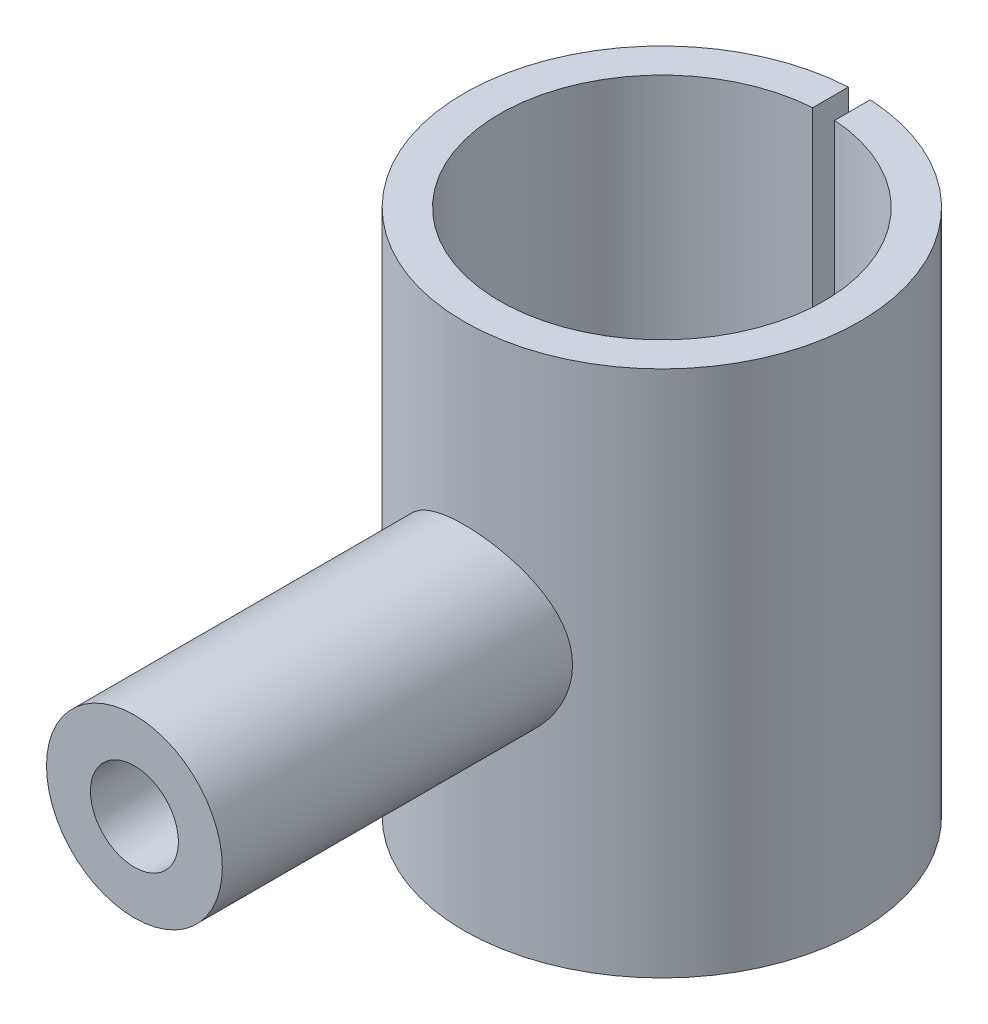
ISO-10303-21;
HEADER;
FILE_DESCRIPTION(('STEP AP214'),'2;1');
FILE_NAME('part.step','',(''),(''),'','','');
FILE_SCHEMA(('AUTOMOTIVE_DESIGN { 1 0 10303 214 1 1 1 1 }'));
ENDSEC;
DATA;
#1=APPLICATION_CONTEXT('core data for automotive mechanical design processes');
#2=APPLICATION_PROTOCOL_DEFINITION('international standard','automotive_design',2000,#1);
#3=PRODUCT_CONTEXT('',#1,'mechanical');
#4=PRODUCT('Part','Part','',(#3));
#5=PRODUCT_RELATED_PRODUCT_CATEGORY('part','',(#4));
#6=PRODUCT_DEFINITION_FORMATION('','',#4);
#7=PRODUCT_DEFINITION_CONTEXT('part definition',#1,'design');
#8=PRODUCT_DEFINITION('design','',#6,#7);
#9=PRODUCT_DEFINITION_SHAPE('','',#8);
#10=(LENGTH_UNIT() NAMED_UNIT(*) SI_UNIT(.MILLI.,.METRE.));
#11=(NAMED_UNIT(*) PLANE_ANGLE_UNIT() SI_UNIT($,.RADIAN.));
#12=(NAMED_UNIT(*) SI_UNIT($,.STERADIAN.) SOLID_ANGLE_UNIT());
#13=UNCERTAINTY_MEASURE_WITH_UNIT(LENGTH_MEASURE(1.E-05),#10,'distance_accuracy_value','');
#14=(GEOMETRIC_REPRESENTATION_CONTEXT(3) GLOBAL_UNCERTAINTY_ASSIGNED_CONTEXT((#13)) GLOBAL_UNIT_ASSIGNED_CONTEXT((#10,
#11,#12)) REPRESENTATION_CONTEXT('',''));
#15=CARTESIAN_POINT('',(0.,0.,0.));
#16=DIRECTION('',(0.,0.,1.));
#17=DIRECTION('',(1.,0.,0.));
#18=AXIS2_PLACEMENT_3D('',#15,#16,#17);
#19=CARTESIAN_POINT('',(0.,76.2,0.));
#20=DIRECTION('',(0.,-1.,0.));
#21=DIRECTION('',(0.,0.,-1.));
#22=AXIS2_PLACEMENT_3D('',#19,#20,#21);
#23=CYLINDRICAL_SURFACE('',#22,28.575);
#24=CARTESIAN_POINT('',(0.,0.,0.));
#25=DIRECTION('',(0.,1.,0.));
#26=DIRECTION('',(0.,0.,1.));
#27=AXIS2_PLACEMENT_3D('',#24,#25,#26);
#28=CIRCLE('',#27,28.575);
#29=CARTESIAN_POINT('',(-1.5875,0.,-28.5308686995331));
#30=VERTEX_POINT('',#29);
#31=CARTESIAN_POINT('',(1.5875,0.,-28.5308686995331));
#32=VERTEX_POINT('',#31);
#33=EDGE_CURVE('E95',#30,#32,#28,.T.);
#34=ORIENTED_EDGE('',*,*,#33,.T.);
#35=DIRECTION('',(0.,-1.,0.));
#36=VECTOR('',#35,1.);
#37=CARTESIAN_POINT('',(1.5875,76.2,-28.5308686995331));
#38=LINE('',#37,#36);
#39=CARTESIAN_POINT('',(1.5875,76.2,-28.5308686995331));
#40=VERTEX_POINT('',#39);
#41=EDGE_CURVE('E58',#32,#40,#38,.F.);
#42=ORIENTED_EDGE('',*,*,#41,.T.);
#43=CARTESIAN_POINT('',(0.,76.2,0.));
#44=DIRECTION('',(0.,1.,0.));
#45=DIRECTION('',(0.,0.,1.));
#46=AXIS2_PLACEMENT_3D('',#43,#44,#45);
#47=CIRCLE('',#46,28.575);
#48=CARTESIAN_POINT('',(-1.5875,76.2,-28.5308686995331));
#49=VERTEX_POINT('',#48);
#50=EDGE_CURVE('E88',#49,#40,#47,.T.);
#51=ORIENTED_EDGE('',*,*,#50,.F.);
#52=DIRECTION('',(0.,-1.,0.));
#53=VECTOR('',#52,1.);
#54=CARTESIAN_POINT('',(-1.5875,76.2,-28.5308686995331));
#55=LINE('',#54,#53);
#56=EDGE_CURVE('E73',#49,#30,#55,.T.);
#57=ORIENTED_EDGE('',*,*,#56,.T.);
#58=EDGE_LOOP('',(#34,#42,#51,#57));
#59=FACE_BOUND('',#58,.T.);
#60=CARTESIAN_POINT('',(-12.7,38.1,25.5976683508479));
#61=CARTESIAN_POINT('',(-12.699997327966,37.7635856181753,25.5976713492033));
#62=CARTESIAN_POINT('',(-12.6866138695812,37.4270792451345,25.6043232716176));
#63=CARTESIAN_POINT('',(-12.6332257255434,36.7565569537208,25.6307059846969));
#64=CARTESIAN_POINT('',(-12.5932051985643,36.4225426369993,25.6504445580944));
#65=CARTESIAN_POINT('',(-12.4868948825839,35.7589277271355,25.7023652959666));
#66=CARTESIAN_POINT('',(-12.4205461877994,35.4293387563965,25.7345753598009));
#67=CARTESIAN_POINT('',(-12.2623412625626,34.777743163896,25.8103328961993));
#68=CARTESIAN_POINT('',(-12.1704885091685,34.4557355150331,25.8538788232547));
#69=CARTESIAN_POINT('',(-11.9626749046417,33.8227478502697,25.9506858796822));
#70=CARTESIAN_POINT('',(-11.84682368077,33.5117249654507,26.0039027003545));
#71=CARTESIAN_POINT('',(-11.5917946291175,32.9009785884305,26.1185844978387));
#72=CARTESIAN_POINT('',(-11.4526160697599,32.6012554509659,26.18004973332));
#73=CARTESIAN_POINT('',(-11.1520734566521,32.0147896359408,26.3094779024876));
#74=CARTESIAN_POINT('',(-10.9907186050112,31.7280416395752,26.3774381375125));
#75=CARTESIAN_POINT('',(-10.6467991676387,31.1686570911979,26.5181224005997));
#76=CARTESIAN_POINT('',(-10.464226836769,30.8960257450956,26.5908481639983));
#77=CARTESIAN_POINT('',(-10.0665807393352,30.3491628706289,26.7440242451697));
#78=CARTESIAN_POINT('',(-9.85017179839616,30.07595629345,26.8246705361347));
#79=CARTESIAN_POINT('',(-9.3958428470508,29.5484314925745,26.9871629233237));
#80=CARTESIAN_POINT('',(-9.15792191540722,29.2941140786444,27.0690090708049));
#81=CARTESIAN_POINT('',(-8.66170288787359,28.8055828326485,27.2318516211706));
#82=CARTESIAN_POINT('',(-8.40339308927126,28.5713807096748,27.3128475053621));
#83=CARTESIAN_POINT('',(-7.86794486895564,28.1246822246367,27.4718772001852));
#84=CARTESIAN_POINT('',(-7.59081292571202,27.9121784565425,27.5499120157287));
#85=CARTESIAN_POINT('',(-7.00451741730128,27.4999249079523,27.7049434774682));
#86=CARTESIAN_POINT('',(-6.69444155981389,27.3013737754519,27.7816853913379));
#87=CARTESIAN_POINT('',(-6.05684925830992,26.9312735740506,27.9276233682466));
#88=CARTESIAN_POINT('',(-5.72933205912699,26.7597256755963,27.9968191041591));
#89=CARTESIAN_POINT('',(-5.05914532722503,26.4453019228626,28.12564748294));
#90=CARTESIAN_POINT('',(-4.71648175427137,26.3024149115784,28.1852838452232));
#91=CARTESIAN_POINT('',(-4.01837666169148,26.0467518019702,28.2932496738143));
#92=CARTESIAN_POINT('',(-3.66293617948707,25.9339732652249,28.3415800557302));
#93=CARTESIAN_POINT('',(-2.96309811169387,25.7455018467772,28.4230093794415));
#94=CARTESIAN_POINT('',(-2.61926287039832,25.6680317363786,28.4568314258619));
#95=CARTESIAN_POINT('',(-1.92537523516523,25.5418449247719,28.5121844028472));
#96=CARTESIAN_POINT('',(-1.57532306280401,25.4931272009163,28.5337157705585));
#97=CARTESIAN_POINT('',(-0.871960299437756,25.4250452510414,28.5638612726751));
#98=CARTESIAN_POINT('',(-0.518651049612987,25.4056694422375,28.5724805041597));
#99=CARTESIAN_POINT('',(0.188420819197821,25.39647734147,28.5765654021095));
#100=CARTESIAN_POINT('',(0.542183416903979,25.4066597094506,28.5720316648806));
#101=CARTESIAN_POINT('',(1.22280552255548,25.454725336652,28.5507125131411));
#102=CARTESIAN_POINT('',(1.54983333075861,25.4906437903109,28.5347962465009));
#103=CARTESIAN_POINT('',(2.19940649961973,25.5875887421072,28.4920895241202));
#104=CARTESIAN_POINT('',(2.521952107113,25.6486138519083,28.4652996696636));
#105=CARTESIAN_POINT('',(3.16039839408475,25.7951567746454,28.4015042920626));
#106=CARTESIAN_POINT('',(3.4762988501764,25.8806754095603,28.3644984260803));
#107=CARTESIAN_POINT('',(4.09944740630779,26.0753960998264,28.2811595598454));
#108=CARTESIAN_POINT('',(4.40669522981575,26.1845989111382,28.2348262618796));
#109=CARTESIAN_POINT('',(5.01531168397176,26.4275692633062,28.1331460943635));
#110=CARTESIAN_POINT('',(5.31652020881048,26.5616846164538,28.0776730455757));
#111=CARTESIAN_POINT('',(5.90647133117426,26.8522569070675,27.9595196115664));
#112=CARTESIAN_POINT('',(6.19521390938464,27.0087138791479,27.8968392151784));
#113=CARTESIAN_POINT('',(6.75879209700934,27.342859898506,27.7656816441141));
#114=CARTESIAN_POINT('',(7.03362615047019,27.52055131385,27.6972038231575));
#115=CARTESIAN_POINT('',(7.56814453162147,27.8960829103156,27.5559480595288));
#116=CARTESIAN_POINT('',(7.82782292055996,28.093930907525,27.4831684533878));
#117=CARTESIAN_POINT('',(8.35048211654676,28.524876610282,27.3291054298983));
#118=CARTESIAN_POINT('',(8.61212372248667,28.7595220316533,27.2476028121537));
#119=CARTESIAN_POINT('',(9.11491897145408,29.2494923620573,27.083552682026));
#120=CARTESIAN_POINT('',(9.35607182136133,29.5048180708778,27.0010051293355));
#121=CARTESIAN_POINT('',(9.81667208238307,30.034873071904,26.836977663645));
#122=CARTESIAN_POINT('',(10.0361104688375,30.3096103510447,26.7554982066549));
#123=CARTESIAN_POINT('',(10.4518969012457,30.8770104821246,26.5958284311184));
#124=CARTESIAN_POINT('',(10.6482413084791,31.1696761478675,26.5176386321386));
#125=CARTESIAN_POINT('',(11.0242188015048,31.7840152850362,26.3636155489879));
#126=CARTESIAN_POINT('',(11.2028046658546,32.1063906877961,26.2880188949901));
#127=CARTESIAN_POINT('',(11.5318423387299,32.7668345896961,26.145351448534));
#128=CARTESIAN_POINT('',(11.6823067445077,33.1048959770366,26.0782768428824));
#129=CARTESIAN_POINT('',(11.9536430334145,33.7944654355975,25.9550238219666));
#130=CARTESIAN_POINT('',(12.0745277409602,34.1459676028028,25.8988406868572));
#131=CARTESIAN_POINT('',(12.2853722493674,34.8599186595767,25.7994936429252));
#132=CARTESIAN_POINT('',(12.3753352718411,35.2223664044843,25.7563283778779));
#133=CARTESIAN_POINT('',(12.5179302765336,35.9292648861481,25.6873093729952));
#134=CARTESIAN_POINT('',(12.5727519738217,36.2731761986204,25.6604474285804));
#135=CARTESIAN_POINT('',(12.6539876138767,36.965133443365,25.6204857706812));
#136=CARTESIAN_POINT('',(12.6804029247936,37.3131791756927,25.6073853943927));
#137=CARTESIAN_POINT('',(12.7044714341516,38.0103769909922,25.5954529427569));
#138=CARTESIAN_POINT('',(12.7021353924347,38.359528611196,25.5966155296695));
#139=CARTESIAN_POINT('',(12.6687579125852,39.0561082203677,25.6131518291473));
#140=CARTESIAN_POINT('',(12.6377176058756,39.4035362767299,25.628524981581));
#141=CARTESIAN_POINT('',(12.5508568015748,40.0670053714474,25.671165474155));
#142=CARTESIAN_POINT('',(12.4971446142819,40.3833910930548,25.697417999628));
#143=CARTESIAN_POINT('',(12.3661999747721,41.0102681040814,25.7606872499087));
#144=CARTESIAN_POINT('',(12.2889595120747,41.3207573476681,25.7977076405697));
#145=CARTESIAN_POINT('',(12.1117322796483,41.933761777312,25.8813861991208));
#146=CARTESIAN_POINT('',(12.0117497559969,42.236278440147,25.9280425677671));
#147=CARTESIAN_POINT('',(11.7898584136153,42.8318357090821,26.0296897590299));
#148=CARTESIAN_POINT('',(11.667940982563,43.1248725395974,26.0846838539561));
#149=CARTESIAN_POINT('',(11.3972665311839,43.7126271248248,26.2041174577956));
#150=CARTESIAN_POINT('',(11.2475597078809,44.0068441552566,26.268867493406));
#151=CARTESIAN_POINT('',(10.9262942858888,44.5818684127944,26.4041113388366));
#152=CARTESIAN_POINT('',(10.754726146677,44.8626697111173,26.4746076515277));
#153=CARTESIAN_POINT('',(10.3908314957672,45.4094798046311,26.6195341345342));
#154=CARTESIAN_POINT('',(10.198501263154,45.6754859352935,26.693965008765));
#155=CARTESIAN_POINT('',(9.794165044481,46.1914631586694,26.8449534890409));
#156=CARTESIAN_POINT('',(9.582158026193,46.4414334089892,26.9215112065105));
#157=CARTESIAN_POINT('',(9.11841522453159,46.9472120308447,27.0822993509983));
#158=CARTESIAN_POINT('',(8.86481875707591,47.2013064978325,27.1665656789871));
#159=CARTESIAN_POINT('',(8.33679131828898,47.6873159989074,27.333224328211));
#160=CARTESIAN_POINT('',(8.06236716583363,47.919238236356,27.4156172514062));
#161=CARTESIAN_POINT('',(7.49393702462966,48.3596412136342,27.5764176263404));
#162=CARTESIAN_POINT('',(7.19991993658644,48.5681084834763,27.6548227739154));
#163=CARTESIAN_POINT('',(6.59422885541936,48.9598417024785,27.805468959327));
#164=CARTESIAN_POINT('',(6.28256259061225,49.1431185634906,27.8777126609678));
#165=CARTESIAN_POINT('',(5.64048865350532,49.4845620807821,28.0147139907725));
#166=CARTESIAN_POINT('',(5.30993939273918,49.6424918621749,28.0793996177268));
#167=CARTESIAN_POINT('',(4.63485179525903,49.9297379892273,28.1986922851326));
#168=CARTESIAN_POINT('',(4.2903132165467,50.0590538396506,28.2532991511432));
#169=CARTESIAN_POINT('',(3.58998690534544,50.2875995524898,28.3507940758034));
#170=CARTESIAN_POINT('',(3.23420562237571,50.3868463304339,28.3936887218827));
#171=CARTESIAN_POINT('',(2.51408770740302,50.5541545345403,28.4664873577243));
#172=CARTESIAN_POINT('',(2.14975183347764,50.6222187131116,28.4963924940258));
#173=CARTESIAN_POINT('',(1.44417478475763,50.7222541439613,28.5404990677894));
#174=CARTESIAN_POINT('',(1.10333563954635,50.7566165205415,28.5557391084525));
#175=CARTESIAN_POINT('',(0.419675127870113,50.7976816989786,28.5739636581927));
#176=CARTESIAN_POINT('',(0.0768538703630382,50.8043860070088,28.576948834632));
#177=CARTESIAN_POINT('',(-0.608022086576996,50.7900594550959,28.5705826984788));
#178=CARTESIAN_POINT('',(-0.950076922545896,50.7690340073268,28.5612337931988));
#179=CARTESIAN_POINT('',(-1.63082745070393,50.699502408862,28.53045940832));
#180=CARTESIAN_POINT('',(-1.96952318182976,50.6509965770818,28.5090340688706));
#181=CARTESIAN_POINT('',(-2.6260553289559,50.5298137974659,28.4558970688691));
#182=CARTESIAN_POINT('',(-2.944149555996,50.4583076771885,28.4246852172738));
#183=CARTESIAN_POINT('',(-3.57285681597859,50.2914097946638,28.3525208424444));
#184=CARTESIAN_POINT('',(-3.88347014168942,50.1960189688255,28.3115687010851));
#185=CARTESIAN_POINT('',(-4.49536857902066,49.9822016011967,28.2208782804644));
#186=CARTESIAN_POINT('',(-4.7966526542388,49.863772510613,28.1711390291145));
#187=CARTESIAN_POINT('',(-5.38817778085994,49.6048593574052,28.0640077121352));
#188=CARTESIAN_POINT('',(-5.67841835250714,49.4643743379755,28.0066153145219));
#189=CARTESIAN_POINT('',(-6.25931680657394,49.1554984215123,27.8826784247913));
#190=CARTESIAN_POINT('',(-6.54938952698414,48.9861267435244,27.8158358349167));
#191=CARTESIAN_POINT('',(-7.1144058021182,48.6255685940265,27.6767149915685));
#192=CARTESIAN_POINT('',(-7.38934378747819,48.4343741705592,27.6044347599724));
#193=CARTESIAN_POINT('',(-7.92270090102938,48.0313922216593,27.4561118002852));
#194=CARTESIAN_POINT('',(-8.18111640624793,47.8196002051748,27.3800682534326));
#195=CARTESIAN_POINT('',(-8.68012801102483,47.3766740795481,27.2259839450273));
#196=CARTESIAN_POINT('',(-8.92072479608372,47.1455407152124,27.1479432604617));
#197=CARTESIAN_POINT('',(-9.40121966468652,46.6461346360497,26.9854957710077));
#198=CARTESIAN_POINT('',(-9.63956478474693,46.3763704789869,26.9010725097106));
#199=CARTESIAN_POINT('',(-10.0928014037676,45.8171821158293,26.7343283427612));
#200=CARTESIAN_POINT('',(-10.3076917648518,45.5277569570115,26.6520075392551));
#201=CARTESIAN_POINT('',(-10.7127325018487,44.9306357884878,26.4917998486235));
#202=CARTESIAN_POINT('',(-10.9028677345931,44.6229287614562,26.4139156917074));
#203=CARTESIAN_POINT('',(-11.2568295732094,43.9910881237402,26.2650204709844));
#204=CARTESIAN_POINT('',(-11.420653528755,43.6669528625662,26.1940100998574));
#205=CARTESIAN_POINT('',(-11.72114996659,43.0028576979387,26.0609363802201));
#206=CARTESIAN_POINT('',(-11.8577067745111,42.6628376243609,25.9989114431288));
#207=CARTESIAN_POINT('',(-12.1013296664917,41.9707009497814,25.8864147372333));
#208=CARTESIAN_POINT('',(-12.2084104907662,41.618590494332,25.8359371960017));
#209=CARTESIAN_POINT('',(-12.3916402468332,40.9057675422631,25.7485566339286));
#210=CARTESIAN_POINT('',(-12.4678703874031,40.5450803107273,25.7116179989269));
#211=CARTESIAN_POINT('',(-12.5887346412339,39.8174363138739,25.652659903681));
#212=CARTESIAN_POINT('',(-12.6333924953597,39.4504844723574,25.630629233888));
#213=CARTESIAN_POINT('',(-12.6746362905175,38.9188190131297,25.6102394860751));
#214=CARTESIAN_POINT('',(-12.6841437031075,38.7552467793249,25.6055300803344));
#215=CARTESIAN_POINT('',(-12.6968262955209,38.4277903148691,25.5992437393876));
#216=CARTESIAN_POINT('',(-12.7000013018546,38.2639060757934,25.5976668900047));
#217=CARTESIAN_POINT('',(-12.7,38.1,25.5976683508479));
#218=B_SPLINE_CURVE_WITH_KNOTS('',3,(#60,#61,#62,#63,#64,#65,#66,#67,#68,#69,#70,#71,#72,#73,
#74,#75,#76,#77,#78,#79,#80,#81,#82,#83,#84,#85,#86,#87,#88,#89,#90,#91,#92,#93,#94,#95,#96,#97,
#98,#99,#100,#101,#102,#103,#104,#105,#106,#107,#108,#109,#110,#111,#112,#113,#114,#115,#116,
#117,#118,#119,#120,#121,#122,#123,#124,#125,#126,#127,#128,#129,#130,#131,#132,#133,#134,#135,
#136,#137,#138,#139,#140,#141,#142,#143,#144,#145,#146,#147,#148,#149,#150,#151,#152,#153,#154,
#155,#156,#157,#158,#159,#160,#161,#162,#163,#164,#165,#166,#167,#168,#169,#170,#171,#172,#173,
#174,#175,#176,#177,#178,#179,#180,#181,#182,#183,#184,#185,#186,#187,#188,#189,#190,#191,#192,
#193,#194,#195,#196,#197,#198,#199,#200,#201,#202,#203,#204,#205,#206,#207,#208,#209,#210,#211,
#212,#213,#214,#215,#216,#217),.UNSPECIFIED.,.T.,.F.,(4,2,2,2,2,2,2,2,2,2,2,2,2,2,2,2,2,2,2,2,2,
2,2,2,2,2,2,2,2,2,2,2,2,2,2,2,2,2,2,2,2,2,2,2,2,2,2,2,2,2,2,2,2,2,2,2,2,2,2,2,2,2,2,2,2,2,2,2,2,
2,2,2,2,2,2,2,2,2,4),(0.,1.00907339930406,2.01874744130542,3.03069334849076,4.04250136120085,
5.0497854246708,6.05710108384787,7.06400000975967,8.07126765115636,9.14332220608516,
10.2154226928282,11.2881430774853,12.360496091256,13.4873979731032,14.6143486867098,
15.7408598500467,16.8672797519407,17.92810197268,18.9888864604556,20.0492520920006,
21.109569651335,22.096544408081,23.0834645948865,24.0704179056604,25.0574027230216,
26.0593738513021,27.0613465319762,28.0634310571561,29.0659056489267,30.1470273305109,
31.2281908432919,32.3098018233054,33.3915829958396,34.518766209956,35.6454432759277,
36.7716309968299,37.8977013489452,38.9441544186024,39.9905570851945,41.0365681602971,
42.0825380070101,43.0473953656793,44.0125815893388,44.9775877547132,45.9429736414696,
46.9511303916022,47.9597286292346,48.9685079256071,49.9773401716651,51.0823147386169,
52.1869290903632,53.2921746091358,54.39693984419,55.5114937399331,56.6260669243351,
57.7400119300051,58.8538585916169,59.8812629262531,60.9086113108765,61.9357592117538,
62.9628951926109,63.9443539380381,64.9257742110283,65.9073031233318,66.8888746269937,
67.915231281243,68.9419631292576,69.9689193475658,70.995836037496,72.1037783245988,
73.2117743381679,74.3204449803203,75.4292272285503,76.542617701136,77.65545037882,
78.7653343710533,79.8743828928315,80.3660049485093,80.8576404730379),.UNSPECIFIED.);
#219=CARTESIAN_POINT('',(-12.7,38.1,25.5976683508479));
#220=VERTEX_POINT('',#219);
#221=EDGE_CURVE('E94',#220,#220,#218,.T.);
#222=ORIENTED_EDGE('',*,*,#221,.F.);
#223=EDGE_LOOP('',(#222));
#224=FACE_BOUND('',#223,.T.);
#225=ADVANCED_FACE('F35',(#59,#224),#23,.T.);
#226=CARTESIAN_POINT('',(0.,76.2,0.));
#227=DIRECTION('',(0.,-1.,0.));
#228=DIRECTION('',(0.,0.,-1.));
#229=AXIS2_PLACEMENT_3D('',#226,#227,#228);
#230=CYLINDRICAL_SURFACE('',#229,23.4315);
#231=DIRECTION('',(0.,-1.,0.));
#232=VECTOR('',#231,1.);
#233=CARTESIAN_POINT('',(1.5875,76.2,-23.3776610463921));
#234=LINE('',#233,#232);
#235=CARTESIAN_POINT('',(1.5875,0.,-23.3776610463921));
#236=VERTEX_POINT('',#235);
#237=CARTESIAN_POINT('',(1.5875,76.2,-23.3776610463921));
#238=VERTEX_POINT('',#237);
#239=EDGE_CURVE('E81',#236,#238,#234,.F.);
#240=ORIENTED_EDGE('',*,*,#239,.F.);
#241=CARTESIAN_POINT('',(0.,0.,0.));
#242=DIRECTION('',(0.,1.,0.));
#243=DIRECTION('',(0.,0.,1.));
#244=AXIS2_PLACEMENT_3D('',#241,#242,#243);
#245=CIRCLE('',#244,23.4315);
#246=CARTESIAN_POINT('',(-1.5875,0.,-23.3776610463921));
#247=VERTEX_POINT('',#246);
#248=EDGE_CURVE('E102',#247,#236,#245,.T.);
#249=ORIENTED_EDGE('',*,*,#248,.F.);
#250=DIRECTION('',(0.,-1.,0.));
#251=VECTOR('',#250,1.);
#252=CARTESIAN_POINT('',(-1.5875,76.2,-23.3776610463921));
#253=LINE('',#252,#251);
#254=CARTESIAN_POINT('',(-1.5875,76.2,-23.3776610463921));
#255=VERTEX_POINT('',#254);
#256=EDGE_CURVE('E50',#255,#247,#253,.T.);
#257=ORIENTED_EDGE('',*,*,#256,.F.);
#258=CARTESIAN_POINT('',(0.,76.2,0.));
#259=DIRECTION('',(0.,1.,0.));
#260=DIRECTION('',(0.,0.,1.));
#261=AXIS2_PLACEMENT_3D('',#258,#259,#260);
#262=CIRCLE('',#261,23.4315);
#263=EDGE_CURVE('E90',#255,#238,#262,.T.);
#264=ORIENTED_EDGE('',*,*,#263,.T.);
#265=EDGE_LOOP('',(#240,#249,#257,#264));
#266=FACE_BOUND('',#265,.T.);
#267=ADVANCED_FACE('F112',(#266),#230,.F.);
#268=CARTESIAN_POINT('',(0.,76.2,0.));
#269=DIRECTION('',(0.,1.,0.));
#270=DIRECTION('',(0.,0.,1.));
#271=AXIS2_PLACEMENT_3D('',#268,#269,#270);
#272=PLANE('',#271);
#273=DIRECTION('',(0.,0.,-1.));
#274=VECTOR('',#273,1.);
#275=CARTESIAN_POINT('',(1.5875,76.2,-6.15332996642651));
#276=LINE('',#275,#274);
#277=EDGE_CURVE('E91',#238,#40,#276,.T.);
#278=ORIENTED_EDGE('',*,*,#277,.F.);
#279=ORIENTED_EDGE('',*,*,#263,.F.);
#280=DIRECTION('',(0.,0.,1.));
#281=VECTOR('',#280,1.);
#282=CARTESIAN_POINT('',(-1.5875,76.2,-6.15332996642651));
#283=LINE('',#282,#281);
#284=EDGE_CURVE('E76',#49,#255,#283,.T.);
#285=ORIENTED_EDGE('',*,*,#284,.F.);
#286=ORIENTED_EDGE('',*,*,#50,.T.);
#287=EDGE_LOOP('',(#278,#279,#285,#286));
#288=FACE_BOUND('',#287,.T.);
#289=ADVANCED_FACE('F87',(#288),#272,.T.);
#290=CARTESIAN_POINT('',(0.,0.,0.));
#291=DIRECTION('',(0.,1.,0.));
#292=DIRECTION('',(0.,0.,1.));
#293=AXIS2_PLACEMENT_3D('',#290,#291,#292);
#294=PLANE('',#293);
#295=ORIENTED_EDGE('',*,*,#248,.T.);
#296=DIRECTION('',(0.,0.,-1.));
#297=VECTOR('',#296,1.);
#298=CARTESIAN_POINT('',(1.5875,0.,0.));
#299=LINE('',#298,#297);
#300=EDGE_CURVE('E11',#236,#32,#299,.T.);
#301=ORIENTED_EDGE('',*,*,#300,.T.);
#302=ORIENTED_EDGE('',*,*,#33,.F.);
#303=DIRECTION('',(0.,0.,1.));
#304=VECTOR('',#303,1.);
#305=CARTESIAN_POINT('',(-1.5875,0.,0.));
#306=LINE('',#305,#304);
#307=EDGE_CURVE('E43',#30,#247,#306,.T.);
#308=ORIENTED_EDGE('',*,*,#307,.T.);
#309=EDGE_LOOP('',(#295,#301,#302,#308));
#310=FACE_BOUND('',#309,.T.);
#311=ADVANCED_FACE('F109',(#310),#294,.F.);
#312=CARTESIAN_POINT('',(0.,38.1,76.2));
#313=DIRECTION('',(0.,0.,-1.));
#314=DIRECTION('',(-1.,0.,0.));
#315=AXIS2_PLACEMENT_3D('',#312,#313,#314);
#316=CYLINDRICAL_SURFACE('',#315,12.7);
#317=CARTESIAN_POINT('',(0.,38.1,76.2));
#318=DIRECTION('',(0.,0.,1.));
#319=DIRECTION('',(1.,0.,0.));
#320=AXIS2_PLACEMENT_3D('',#317,#318,#319);
#321=CIRCLE('',#320,12.7);
#322=CARTESIAN_POINT('',(12.7,38.1,76.2));
#323=VERTEX_POINT('',#322);
#324=EDGE_CURVE('E115',#323,#323,#321,.T.);
#325=ORIENTED_EDGE('',*,*,#324,.F.);
#326=EDGE_LOOP('',(#325));
#327=FACE_BOUND('',#326,.T.);
#328=ORIENTED_EDGE('',*,*,#221,.T.);
#329=EDGE_LOOP('',(#328));
#330=FACE_BOUND('',#329,.T.);
#331=ADVANCED_FACE('F125',(#327,#330),#316,.T.);
#332=CARTESIAN_POINT('',(0.,38.1,76.2));
#333=DIRECTION('',(0.,0.,-1.));
#334=DIRECTION('',(-1.,0.,0.));
#335=AXIS2_PLACEMENT_3D('',#332,#333,#334);
#336=CYLINDRICAL_SURFACE('',#335,6.35);
#337=CARTESIAN_POINT('',(0.,38.1,31.75));
#338=DIRECTION('',(0.,0.,1.));
#339=DIRECTION('',(1.,0.,0.));
#340=AXIS2_PLACEMENT_3D('',#337,#338,#339);
#341=CIRCLE('',#340,6.35);
#342=CARTESIAN_POINT('',(-6.35,38.1,31.75));
#343=VERTEX_POINT('',#342);
#344=EDGE_CURVE('E98',#343,#343,#341,.T.);
#345=CARTESIAN_POINT('',(0.,38.1,76.2));
#346=DIRECTION('',(0.,0.,1.));
#347=DIRECTION('',(1.,0.,0.));
#348=AXIS2_PLACEMENT_3D('',#345,#346,#347);
#349=CIRCLE('',#348,6.35);
#350=CARTESIAN_POINT('',(-6.35,38.1,76.2));
#351=VERTEX_POINT('',#350);
#352=EDGE_CURVE('E113',#351,#351,#349,.T.);
#353=CARTESIAN_POINT('',(-6.35,38.1,31.75));
#354=CARTESIAN_POINT('',(-6.35,38.1,32.2130208333333));
#355=CARTESIAN_POINT('',(-6.35,38.1,32.6760416666667));
#356=CARTESIAN_POINT('',(-6.35,38.1,33.6020833333333));
#357=CARTESIAN_POINT('',(-6.35,38.1,34.0651041666667));
#358=CARTESIAN_POINT('',(-6.35,38.1,34.9911458333333));
#359=CARTESIAN_POINT('',(-6.35,38.1,35.4541666666667));
#360=CARTESIAN_POINT('',(-6.35,38.1,36.3802083333333));
#361=CARTESIAN_POINT('',(-6.35,38.1,36.8432291666667));
#362=CARTESIAN_POINT('',(-6.35,38.1,37.7692708333333));
#363=CARTESIAN_POINT('',(-6.35,38.1,38.2322916666667));
#364=CARTESIAN_POINT('',(-6.35,38.1,39.1583333333333));
#365=CARTESIAN_POINT('',(-6.35,38.1,39.6213541666667));
#366=CARTESIAN_POINT('',(-6.35,38.1,40.5473958333333));
#367=CARTESIAN_POINT('',(-6.35,38.1,41.0104166666667));
#368=CARTESIAN_POINT('',(-6.35,38.1,41.9364583333333));
#369=CARTESIAN_POINT('',(-6.35,38.1,42.3994791666667));
#370=CARTESIAN_POINT('',(-6.35,38.1,43.3255208333333));
#371=CARTESIAN_POINT('',(-6.35,38.1,43.7885416666667));
#372=CARTESIAN_POINT('',(-6.35,38.1,44.7145833333333));
#373=CARTESIAN_POINT('',(-6.35,38.1,45.1776041666667));
#374=CARTESIAN_POINT('',(-6.35,38.1,46.1036458333333));
#375=CARTESIAN_POINT('',(-6.35,38.1,46.5666666666667));
#376=CARTESIAN_POINT('',(-6.35,38.1,47.4927083333333));
#377=CARTESIAN_POINT('',(-6.35,38.1,47.9557291666667));
#378=CARTESIAN_POINT('',(-6.35,38.1,48.8817708333333));
#379=CARTESIAN_POINT('',(-6.35,38.1,49.3447916666667));
#380=CARTESIAN_POINT('',(-6.35,38.1,50.2708333333333));
#381=CARTESIAN_POINT('',(-6.35,38.1,50.7338541666667));
#382=CARTESIAN_POINT('',(-6.35,38.1,51.6598958333333));
#383=CARTESIAN_POINT('',(-6.35,38.1,52.1229166666667));
#384=CARTESIAN_POINT('',(-6.35,38.1,53.0489583333333));
#385=CARTESIAN_POINT('',(-6.35,38.1,53.5119791666667));
#386=CARTESIAN_POINT('',(-6.35,38.1,54.4380208333333));
#387=CARTESIAN_POINT('',(-6.35,38.1,54.9010416666667));
#388=CARTESIAN_POINT('',(-6.35,38.1,55.8270833333333));
#389=CARTESIAN_POINT('',(-6.35,38.1,56.2901041666667));
#390=CARTESIAN_POINT('',(-6.35,38.1,57.2161458333333));
#391=CARTESIAN_POINT('',(-6.35,38.1,57.6791666666667));
#392=CARTESIAN_POINT('',(-6.35,38.1,58.6052083333333));
#393=CARTESIAN_POINT('',(-6.35,38.1,59.0682291666667));
#394=CARTESIAN_POINT('',(-6.35,38.1,59.9942708333333));
#395=CARTESIAN_POINT('',(-6.35,38.1,60.4572916666667));
#396=CARTESIAN_POINT('',(-6.35,38.1,61.3833333333333));
#397=CARTESIAN_POINT('',(-6.35,38.1,61.8463541666667));
#398=CARTESIAN_POINT('',(-6.35,38.1,62.7723958333333));
#399=CARTESIAN_POINT('',(-6.35,38.1,63.2354166666667));
#400=CARTESIAN_POINT('',(-6.35,38.1,64.1614583333333));
#401=CARTESIAN_POINT('',(-6.35,38.1,64.6244791666667));
#402=CARTESIAN_POINT('',(-6.35,38.1,65.5505208333333));
#403=CARTESIAN_POINT('',(-6.35,38.1,66.0135416666667));
#404=CARTESIAN_POINT('',(-6.35,38.1,66.9395833333333));
#405=CARTESIAN_POINT('',(-6.35,38.1,67.4026041666667));
#406=CARTESIAN_POINT('',(-6.35,38.1,68.3286458333333));
#407=CARTESIAN_POINT('',(-6.35,38.1,68.7916666666667));
#408=CARTESIAN_POINT('',(-6.35,38.1,69.7177083333333));
#409=CARTESIAN_POINT('',(-6.35,38.1,70.1807291666667));
#410=CARTESIAN_POINT('',(-6.35,38.1,71.1067708333333));
#411=CARTESIAN_POINT('',(-6.35,38.1,71.5697916666667));
#412=CARTESIAN_POINT('',(-6.35,38.1,72.4958333333333));
#413=CARTESIAN_POINT('',(-6.35,38.1,72.9588541666667));
#414=CARTESIAN_POINT('',(-6.35,38.1,73.8848958333333));
#415=CARTESIAN_POINT('',(-6.35,38.1,74.3479166666667));
#416=CARTESIAN_POINT('',(-6.35,38.1,75.2739583333333));
#417=CARTESIAN_POINT('',(-6.35,38.1,75.7369791666667));
#418=CARTESIAN_POINT('',(-6.35,38.1,76.2));
#419=B_SPLINE_CURVE_WITH_KNOTS('',3,(#353,#354,#355,#356,#357,#358,#359,#360,#361,#362,#363,
#364,#365,#366,#367,#368,#369,#370,#371,#372,#373,#374,#375,#376,#377,#378,#379,#380,#381,#382,
#383,#384,#385,#386,#387,#388,#389,#390,#391,#392,#393,#394,#395,#396,#397,#398,#399,#400,#401,
#402,#403,#404,#405,#406,#407,#408,#409,#410,#411,#412,#413,#414,#415,#416,#417,#418),
.UNSPECIFIED.,.F.,.F.,(4,2,2,2,2,2,2,2,2,2,2,2,2,2,2,2,2,2,2,2,2,2,2,2,2,2,2,2,2,2,2,2,4),(0.,
1.3890625,2.778125,4.1671875,5.55625,6.9453125,8.334375,9.7234375,11.1125,12.5015625,13.890625,
15.2796875,16.66875,18.0578125,19.446875,20.8359375,22.225,23.6140625,25.003125,26.3921875,
27.78125,29.1703125,30.559375,31.9484375,33.3375,34.7265625,36.115625,37.5046875,38.89375,
40.2828125,41.671875,43.0609375,44.45),.UNSPECIFIED.);
#420=EDGE_CURVE('BSEAM130',#343,#351,#419,.T.);
#421=ORIENTED_EDGE('',*,*,#344,.F.);
#422=ORIENTED_EDGE('',*,*,#352,.T.);
#423=ORIENTED_EDGE('',*,*,#420,.T.);
#424=ORIENTED_EDGE('',*,*,#420,.F.);
#425=EDGE_LOOP('',(#421,#423,#422,#424));
#426=FACE_BOUND('',#425,.T.);
#427=ADVANCED_FACE('F130',(#426),#336,.F.);
#428=CARTESIAN_POINT('',(0.,0.,76.2));
#429=DIRECTION('',(0.,0.,1.));
#430=DIRECTION('',(1.,0.,0.));
#431=AXIS2_PLACEMENT_3D('',#428,#429,#430);
#432=PLANE('',#431);
#433=ORIENTED_EDGE('',*,*,#324,.T.);
#434=EDGE_LOOP('',(#433));
#435=FACE_BOUND('',#434,.T.);
#436=ORIENTED_EDGE('',*,*,#352,.F.);
#437=EDGE_LOOP('',(#436));
#438=FACE_BOUND('',#437,.T.);
#439=ADVANCED_FACE('F180',(#435,#438),#432,.T.);
#440=CARTESIAN_POINT('',(0.,38.1,31.75));
#441=DIRECTION('',(0.,0.,1.));
#442=DIRECTION('',(1.,0.,0.));
#443=AXIS2_PLACEMENT_3D('',#440,#441,#442);
#444=PLANE('',#443);
#445=ORIENTED_EDGE('',*,*,#344,.T.);
#446=EDGE_LOOP('',(#445));
#447=FACE_BOUND('',#446,.T.);
#448=ADVANCED_FACE('F166',(#447),#444,.T.);
#449=CARTESIAN_POINT('',(-1.5875,0.,-6.15332996642651));
#450=DIRECTION('',(-1.,0.,0.));
#451=DIRECTION('',(0.,0.,1.));
#452=AXIS2_PLACEMENT_3D('',#449,#450,#451);
#453=PLANE('',#452);
#454=ORIENTED_EDGE('',*,*,#284,.T.);
#455=ORIENTED_EDGE('',*,*,#256,.T.);
#456=ORIENTED_EDGE('',*,*,#307,.F.);
#457=ORIENTED_EDGE('',*,*,#56,.F.);
#458=EDGE_LOOP('',(#454,#455,#456,#457));
#459=FACE_BOUND('',#458,.T.);
#460=ADVANCED_FACE('F75',(#459),#453,.F.);
#461=CARTESIAN_POINT('',(1.5875,0.,-6.15332996642651));
#462=DIRECTION('',(1.,0.,0.));
#463=DIRECTION('',(0.,0.,-1.));
#464=AXIS2_PLACEMENT_3D('',#461,#462,#463);
#465=PLANE('',#464);
#466=ORIENTED_EDGE('',*,*,#300,.F.);
#467=ORIENTED_EDGE('',*,*,#239,.T.);
#468=ORIENTED_EDGE('',*,*,#277,.T.);
#469=ORIENTED_EDGE('',*,*,#41,.F.);
#470=EDGE_LOOP('',(#466,#467,#468,#469));
#471=FACE_BOUND('',#470,.T.);
#472=ADVANCED_FACE('F165',(#471),#465,.F.);
#473=CLOSED_SHELL('',(#225,#267,#289,#311,#331,#427,#439,#448,#460,#472));
#474=MANIFOLD_SOLID_BREP('B2',#473);
#475=ADVANCED_BREP_SHAPE_REPRESENTATION('',(#18,#474),#14);
#476=SHAPE_DEFINITION_REPRESENTATION(#9,#475);
ENDSEC;
END-ISO-10303-21;
